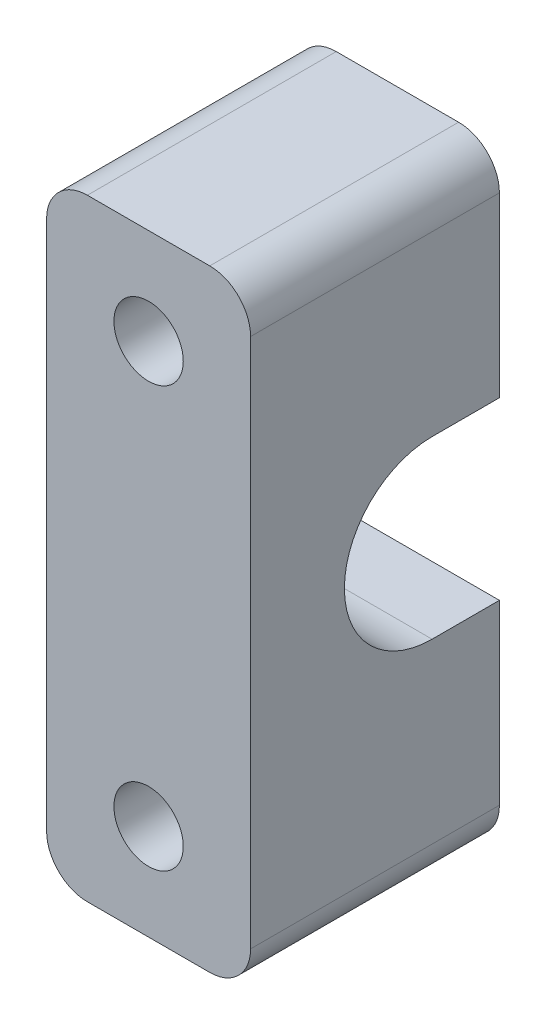
ISO-10303-21;
HEADER;
FILE_DESCRIPTION(('STEP AP214'),'2;1');
FILE_NAME('part.step','',(''),(''),'','','');
FILE_SCHEMA(('AUTOMOTIVE_DESIGN { 1 0 10303 214 1 1 1 1 }'));
ENDSEC;
DATA;
#1=APPLICATION_CONTEXT('core data for automotive mechanical design processes');
#2=APPLICATION_PROTOCOL_DEFINITION('international standard','automotive_design',2000,#1);
#3=PRODUCT_CONTEXT('',#1,'mechanical');
#4=PRODUCT('Part','Part','',(#3));
#5=PRODUCT_RELATED_PRODUCT_CATEGORY('part','',(#4));
#6=PRODUCT_DEFINITION_FORMATION('','',#4);
#7=PRODUCT_DEFINITION_CONTEXT('part definition',#1,'design');
#8=PRODUCT_DEFINITION('design','',#6,#7);
#9=PRODUCT_DEFINITION_SHAPE('','',#8);
#10=(LENGTH_UNIT() NAMED_UNIT(*) SI_UNIT(.MILLI.,.METRE.));
#11=(NAMED_UNIT(*) PLANE_ANGLE_UNIT() SI_UNIT($,.RADIAN.));
#12=(NAMED_UNIT(*) SI_UNIT($,.STERADIAN.) SOLID_ANGLE_UNIT());
#13=UNCERTAINTY_MEASURE_WITH_UNIT(LENGTH_MEASURE(1.E-05),#10,'distance_accuracy_value','');
#14=(GEOMETRIC_REPRESENTATION_CONTEXT(3) GLOBAL_UNCERTAINTY_ASSIGNED_CONTEXT((#13)) GLOBAL_UNIT_ASSIGNED_CONTEXT((#10,
#11,#12)) REPRESENTATION_CONTEXT('',''));
#15=CARTESIAN_POINT('',(0.,0.,0.));
#16=DIRECTION('',(0.,0.,1.));
#17=DIRECTION('',(1.,0.,0.));
#18=AXIS2_PLACEMENT_3D('',#15,#16,#17);
#19=CARTESIAN_POINT('',(-2.,0.,-2.8));
#20=DIRECTION('',(1.,0.,0.));
#21=DIRECTION('',(0.,0.,-1.));
#22=AXIS2_PLACEMENT_3D('',#19,#20,#21);
#23=CYLINDRICAL_SURFACE('',#22,4.3);
#24=DIRECTION('',(1.,0.,0.));
#25=VECTOR('',#24,1.);
#26=CARTESIAN_POINT('',(-16.6823022717829,4.3,-2.8));
#27=LINE('',#26,#25);
#28=CARTESIAN_POINT('',(-2.,4.3,-2.8));
#29=VERTEX_POINT('',#28);
#30=CARTESIAN_POINT('',(5.,4.3,-2.8));
#31=VERTEX_POINT('',#30);
#32=EDGE_CURVE('E149',#29,#31,#27,.T.);
#33=ORIENTED_EDGE('',*,*,#32,.T.);
#34=CARTESIAN_POINT('',(5.,0.,-2.8));
#35=DIRECTION('',(1.,0.,0.));
#36=DIRECTION('',(0.,0.,-1.));
#37=AXIS2_PLACEMENT_3D('',#34,#35,#36);
#38=CIRCLE('',#37,4.3);
#39=CARTESIAN_POINT('',(5.,-4.3,-2.8));
#40=VERTEX_POINT('',#39);
#41=EDGE_CURVE('E142',#31,#40,#38,.T.);
#42=ORIENTED_EDGE('',*,*,#41,.T.);
#43=DIRECTION('',(1.,0.,0.));
#44=VECTOR('',#43,1.);
#45=CARTESIAN_POINT('',(-16.6823022717829,-4.3,-2.8));
#46=LINE('',#45,#44);
#47=CARTESIAN_POINT('',(-2.,-4.3,-2.8));
#48=VERTEX_POINT('',#47);
#49=EDGE_CURVE('E122',#48,#40,#46,.T.);
#50=ORIENTED_EDGE('',*,*,#49,.F.);
#51=CARTESIAN_POINT('',(-2.,0.,-2.8));
#52=DIRECTION('',(1.,0.,0.));
#53=DIRECTION('',(0.,0.,-1.));
#54=AXIS2_PLACEMENT_3D('',#51,#52,#53);
#55=CIRCLE('',#54,4.3);
#56=EDGE_CURVE('E150',#29,#48,#55,.T.);
#57=ORIENTED_EDGE('',*,*,#56,.F.);
#58=EDGE_LOOP('',(#33,#42,#50,#57));
#59=FACE_BOUND('',#58,.T.);
#60=ADVANCED_FACE('F33',(#59),#23,.F.);
#61=CARTESIAN_POINT('',(5.,-15.,-6.1));
#62=DIRECTION('',(0.,0.,1.));
#63=DIRECTION('',(1.,0.,0.));
#64=AXIS2_PLACEMENT_3D('',#61,#62,#63);
#65=PLANE('',#64);
#66=CARTESIAN_POINT('',(0.,-10.3,-6.1));
#67=DIRECTION('',(0.,0.,-1.));
#68=DIRECTION('',(1.,0.,0.));
#69=AXIS2_PLACEMENT_3D('',#66,#67,#68);
#70=CIRCLE('',#69,1.7);
#71=CARTESIAN_POINT('',(1.7,-10.3,-6.1));
#72=VERTEX_POINT('',#71);
#73=EDGE_CURVE('E239',#72,#72,#70,.T.);
#74=ORIENTED_EDGE('',*,*,#73,.F.);
#75=EDGE_LOOP('',(#74));
#76=FACE_BOUND('',#75,.T.);
#77=CARTESIAN_POINT('',(0.,10.3,-6.1));
#78=DIRECTION('',(0.,0.,1.));
#79=DIRECTION('',(1.,0.,0.));
#80=AXIS2_PLACEMENT_3D('',#77,#78,#79);
#81=CIRCLE('',#80,1.7);
#82=CARTESIAN_POINT('',(1.7,10.3,-6.1));
#83=VERTEX_POINT('',#82);
#84=EDGE_CURVE('E151',#83,#83,#81,.T.);
#85=ORIENTED_EDGE('',*,*,#84,.T.);
#86=EDGE_LOOP('',(#85));
#87=FACE_BOUND('',#86,.T.);
#88=DIRECTION('',(0.,1.,0.));
#89=VECTOR('',#88,1.);
#90=CARTESIAN_POINT('',(-2.,-15.,-6.1));
#91=LINE('',#90,#89);
#92=CARTESIAN_POINT('',(-2.,-4.3,-6.1));
#93=VERTEX_POINT('',#92);
#94=CARTESIAN_POINT('',(-2.,4.3,-6.1));
#95=VERTEX_POINT('',#94);
#96=EDGE_CURVE('E181',#93,#95,#91,.T.);
#97=ORIENTED_EDGE('',*,*,#96,.F.);
#98=DIRECTION('',(1.,0.,0.));
#99=VECTOR('',#98,1.);
#100=CARTESIAN_POINT('',(-16.6823022717829,-4.3,-6.1));
#101=LINE('',#100,#99);
#102=CARTESIAN_POINT('',(5.,-4.3,-6.1));
#103=VERTEX_POINT('',#102);
#104=EDGE_CURVE('E134',#93,#103,#101,.T.);
#105=ORIENTED_EDGE('',*,*,#104,.T.);
#106=DIRECTION('',(0.,1.,0.));
#107=VECTOR('',#106,1.);
#108=CARTESIAN_POINT('',(5.,-15.,-6.1));
#109=LINE('',#108,#107);
#110=CARTESIAN_POINT('',(5.,-13.,-6.1));
#111=VERTEX_POINT('',#110);
#112=EDGE_CURVE('E145',#111,#103,#109,.T.);
#113=ORIENTED_EDGE('',*,*,#112,.F.);
#114=CARTESIAN_POINT('',(3.,-13.,-6.1));
#115=DIRECTION('',(0.,0.,1.));
#116=DIRECTION('',(1.,0.,0.));
#117=AXIS2_PLACEMENT_3D('',#114,#115,#116);
#118=CIRCLE('',#117,2.);
#119=CARTESIAN_POINT('',(3.,-15.,-6.1));
#120=VERTEX_POINT('',#119);
#121=EDGE_CURVE('E193',#111,#120,#118,.F.);
#122=ORIENTED_EDGE('',*,*,#121,.T.);
#123=DIRECTION('',(-1.,0.,0.));
#124=VECTOR('',#123,1.);
#125=CARTESIAN_POINT('',(5.,-15.,-6.1));
#126=LINE('',#125,#124);
#127=CARTESIAN_POINT('',(-3.,-15.,-6.1));
#128=VERTEX_POINT('',#127);
#129=EDGE_CURVE('E165',#120,#128,#126,.T.);
#130=ORIENTED_EDGE('',*,*,#129,.T.);
#131=CARTESIAN_POINT('',(-3.,-13.,-6.1));
#132=DIRECTION('',(0.,0.,1.));
#133=DIRECTION('',(1.,0.,0.));
#134=AXIS2_PLACEMENT_3D('',#131,#132,#133);
#135=CIRCLE('',#134,2.);
#136=CARTESIAN_POINT('',(-5.,-13.,-6.1));
#137=VERTEX_POINT('',#136);
#138=EDGE_CURVE('E195',#128,#137,#135,.F.);
#139=ORIENTED_EDGE('',*,*,#138,.T.);
#140=DIRECTION('',(0.,1.,0.));
#141=VECTOR('',#140,1.);
#142=CARTESIAN_POINT('',(-5.,-15.,-6.1));
#143=LINE('',#142,#141);
#144=CARTESIAN_POINT('',(-5.,13.,-6.1));
#145=VERTEX_POINT('',#144);
#146=EDGE_CURVE('E153',#137,#145,#143,.T.);
#147=ORIENTED_EDGE('',*,*,#146,.T.);
#148=CARTESIAN_POINT('',(-3.,13.,-6.1));
#149=DIRECTION('',(0.,0.,1.));
#150=DIRECTION('',(1.,0.,0.));
#151=AXIS2_PLACEMENT_3D('',#148,#149,#150);
#152=CIRCLE('',#151,2.);
#153=CARTESIAN_POINT('',(-3.,15.,-6.1));
#154=VERTEX_POINT('',#153);
#155=EDGE_CURVE('E191',#145,#154,#152,.F.);
#156=ORIENTED_EDGE('',*,*,#155,.T.);
#157=DIRECTION('',(-1.,0.,0.));
#158=VECTOR('',#157,1.);
#159=CARTESIAN_POINT('',(5.,15.,-6.1));
#160=LINE('',#159,#158);
#161=CARTESIAN_POINT('',(3.,15.,-6.1));
#162=VERTEX_POINT('',#161);
#163=EDGE_CURVE('E178',#162,#154,#160,.T.);
#164=ORIENTED_EDGE('',*,*,#163,.F.);
#165=CARTESIAN_POINT('',(3.,13.,-6.1));
#166=DIRECTION('',(0.,0.,1.));
#167=DIRECTION('',(1.,0.,0.));
#168=AXIS2_PLACEMENT_3D('',#165,#166,#167);
#169=CIRCLE('',#168,2.);
#170=CARTESIAN_POINT('',(5.,13.,-6.1));
#171=VERTEX_POINT('',#170);
#172=EDGE_CURVE('E188',#162,#171,#169,.F.);
#173=ORIENTED_EDGE('',*,*,#172,.T.);
#174=CARTESIAN_POINT('',(5.,4.3,-6.1));
#175=VERTEX_POINT('',#174);
#176=EDGE_CURVE('E162',#175,#171,#109,.T.);
#177=ORIENTED_EDGE('',*,*,#176,.F.);
#178=DIRECTION('',(1.,0.,0.));
#179=VECTOR('',#178,1.);
#180=CARTESIAN_POINT('',(-16.6823022717829,4.3,-6.1));
#181=LINE('',#180,#179);
#182=EDGE_CURVE('E231',#95,#175,#181,.T.);
#183=ORIENTED_EDGE('',*,*,#182,.F.);
#184=EDGE_LOOP('',(#97,#105,#113,#122,#130,#139,#147,#156,#164,#173,#177,#183));
#185=FACE_BOUND('',#184,.T.);
#186=ADVANCED_FACE('F218',(#76,#87,#185),#65,.F.);
#187=CARTESIAN_POINT('',(5.,15.,6.1));
#188=DIRECTION('',(0.,-1.,0.));
#189=DIRECTION('',(0.,0.,-1.));
#190=AXIS2_PLACEMENT_3D('',#187,#188,#189);
#191=PLANE('',#190);
#192=ORIENTED_EDGE('',*,*,#163,.T.);
#193=DIRECTION('',(0.,0.,1.));
#194=VECTOR('',#193,1.);
#195=CARTESIAN_POINT('',(-3.,15.,6.1));
#196=LINE('',#195,#194);
#197=CARTESIAN_POINT('',(-3.,15.,6.1));
#198=VERTEX_POINT('',#197);
#199=EDGE_CURVE('E11',#154,#198,#196,.T.);
#200=ORIENTED_EDGE('',*,*,#199,.T.);
#201=DIRECTION('',(-1.,0.,0.));
#202=VECTOR('',#201,1.);
#203=CARTESIAN_POINT('',(5.,15.,6.1));
#204=LINE('',#203,#202);
#205=CARTESIAN_POINT('',(3.,15.,6.1));
#206=VERTEX_POINT('',#205);
#207=EDGE_CURVE('E176',#206,#198,#204,.T.);
#208=ORIENTED_EDGE('',*,*,#207,.F.);
#209=DIRECTION('',(0.,0.,1.));
#210=VECTOR('',#209,1.);
#211=CARTESIAN_POINT('',(3.,15.,6.1));
#212=LINE('',#211,#210);
#213=EDGE_CURVE('E41',#206,#162,#212,.F.);
#214=ORIENTED_EDGE('',*,*,#213,.T.);
#215=EDGE_LOOP('',(#192,#200,#208,#214));
#216=FACE_BOUND('',#215,.T.);
#217=ADVANCED_FACE('F214',(#216),#191,.F.);
#218=CARTESIAN_POINT('',(5.,-15.,6.1));
#219=DIRECTION('',(0.,0.,-1.));
#220=DIRECTION('',(-1.,0.,0.));
#221=AXIS2_PLACEMENT_3D('',#218,#219,#220);
#222=PLANE('',#221);
#223=CARTESIAN_POINT('',(0.,-10.3,6.1));
#224=DIRECTION('',(0.,0.,-1.));
#225=DIRECTION('',(1.,0.,0.));
#226=AXIS2_PLACEMENT_3D('',#223,#224,#225);
#227=CIRCLE('',#226,1.7);
#228=CARTESIAN_POINT('',(1.7,-10.3,6.1));
#229=VERTEX_POINT('',#228);
#230=EDGE_CURVE('E237',#229,#229,#227,.T.);
#231=ORIENTED_EDGE('',*,*,#230,.T.);
#232=EDGE_LOOP('',(#231));
#233=FACE_BOUND('',#232,.T.);
#234=CARTESIAN_POINT('',(0.,10.3,6.1));
#235=DIRECTION('',(0.,0.,1.));
#236=DIRECTION('',(1.,0.,0.));
#237=AXIS2_PLACEMENT_3D('',#234,#235,#236);
#238=CIRCLE('',#237,1.7);
#239=CARTESIAN_POINT('',(1.7,10.3,6.1));
#240=VERTEX_POINT('',#239);
#241=EDGE_CURVE('E156',#240,#240,#238,.T.);
#242=ORIENTED_EDGE('',*,*,#241,.F.);
#243=EDGE_LOOP('',(#242));
#244=FACE_BOUND('',#243,.T.);
#245=DIRECTION('',(0.,-1.,0.));
#246=VECTOR('',#245,1.);
#247=CARTESIAN_POINT('',(-5.,-15.,6.1));
#248=LINE('',#247,#246);
#249=CARTESIAN_POINT('',(-5.,13.,6.1));
#250=VERTEX_POINT('',#249);
#251=CARTESIAN_POINT('',(-5.,-13.,6.1));
#252=VERTEX_POINT('',#251);
#253=EDGE_CURVE('E168',#250,#252,#248,.T.);
#254=ORIENTED_EDGE('',*,*,#253,.T.);
#255=CARTESIAN_POINT('',(-3.,-13.,6.1));
#256=DIRECTION('',(0.,0.,-1.));
#257=DIRECTION('',(-1.,0.,0.));
#258=AXIS2_PLACEMENT_3D('',#255,#256,#257);
#259=CIRCLE('',#258,2.);
#260=CARTESIAN_POINT('',(-3.,-15.,6.1));
#261=VERTEX_POINT('',#260);
#262=EDGE_CURVE('E205',#252,#261,#259,.F.);
#263=ORIENTED_EDGE('',*,*,#262,.T.);
#264=DIRECTION('',(-1.,0.,0.));
#265=VECTOR('',#264,1.);
#266=CARTESIAN_POINT('',(5.,-15.,6.1));
#267=LINE('',#266,#265);
#268=CARTESIAN_POINT('',(3.,-15.,6.1));
#269=VERTEX_POINT('',#268);
#270=EDGE_CURVE('E173',#269,#261,#267,.T.);
#271=ORIENTED_EDGE('',*,*,#270,.F.);
#272=CARTESIAN_POINT('',(3.,-13.,6.1));
#273=DIRECTION('',(0.,0.,-1.));
#274=DIRECTION('',(-1.,0.,0.));
#275=AXIS2_PLACEMENT_3D('',#272,#273,#274);
#276=CIRCLE('',#275,2.);
#277=CARTESIAN_POINT('',(5.,-13.,6.1));
#278=VERTEX_POINT('',#277);
#279=EDGE_CURVE('E203',#269,#278,#276,.F.);
#280=ORIENTED_EDGE('',*,*,#279,.T.);
#281=DIRECTION('',(0.,-1.,0.));
#282=VECTOR('',#281,1.);
#283=CARTESIAN_POINT('',(5.,-15.,6.1));
#284=LINE('',#283,#282);
#285=CARTESIAN_POINT('',(5.,13.,6.1));
#286=VERTEX_POINT('',#285);
#287=EDGE_CURVE('E161',#286,#278,#284,.T.);
#288=ORIENTED_EDGE('',*,*,#287,.F.);
#289=CARTESIAN_POINT('',(3.,13.,6.1));
#290=DIRECTION('',(0.,0.,-1.));
#291=DIRECTION('',(-1.,0.,0.));
#292=AXIS2_PLACEMENT_3D('',#289,#290,#291);
#293=CIRCLE('',#292,2.);
#294=EDGE_CURVE('E55',#286,#206,#293,.F.);
#295=ORIENTED_EDGE('',*,*,#294,.T.);
#296=ORIENTED_EDGE('',*,*,#207,.T.);
#297=CARTESIAN_POINT('',(-3.,13.,6.1));
#298=DIRECTION('',(0.,0.,-1.));
#299=DIRECTION('',(-1.,0.,0.));
#300=AXIS2_PLACEMENT_3D('',#297,#298,#299);
#301=CIRCLE('',#300,2.);
#302=EDGE_CURVE('E48',#198,#250,#301,.F.);
#303=ORIENTED_EDGE('',*,*,#302,.T.);
#304=EDGE_LOOP('',(#254,#263,#271,#280,#288,#295,#296,#303));
#305=FACE_BOUND('',#304,.T.);
#306=ADVANCED_FACE('F223',(#233,#244,#305),#222,.F.);
#307=CARTESIAN_POINT('',(5.,-15.,6.1));
#308=DIRECTION('',(0.,1.,0.));
#309=DIRECTION('',(0.,0.,1.));
#310=AXIS2_PLACEMENT_3D('',#307,#308,#309);
#311=PLANE('',#310);
#312=ORIENTED_EDGE('',*,*,#270,.T.);
#313=DIRECTION('',(0.,0.,-1.));
#314=VECTOR('',#313,1.);
#315=CARTESIAN_POINT('',(-3.,-15.,-6.1));
#316=LINE('',#315,#314);
#317=EDGE_CURVE('E185',#261,#128,#316,.T.);
#318=ORIENTED_EDGE('',*,*,#317,.T.);
#319=ORIENTED_EDGE('',*,*,#129,.F.);
#320=DIRECTION('',(0.,0.,-1.));
#321=VECTOR('',#320,1.);
#322=CARTESIAN_POINT('',(3.,-15.,6.1));
#323=LINE('',#322,#321);
#324=EDGE_CURVE('E183',#120,#269,#323,.F.);
#325=ORIENTED_EDGE('',*,*,#324,.T.);
#326=EDGE_LOOP('',(#312,#318,#319,#325));
#327=FACE_BOUND('',#326,.T.);
#328=ADVANCED_FACE('F249',(#327),#311,.F.);
#329=CARTESIAN_POINT('',(5.,0.,0.));
#330=DIRECTION('',(-1.,0.,0.));
#331=DIRECTION('',(0.,0.,1.));
#332=AXIS2_PLACEMENT_3D('',#329,#330,#331);
#333=PLANE('',#332);
#334=ORIENTED_EDGE('',*,*,#41,.F.);
#335=DIRECTION('',(0.,0.,1.));
#336=VECTOR('',#335,1.);
#337=CARTESIAN_POINT('',(5.,4.3,-2.8));
#338=LINE('',#337,#336);
#339=EDGE_CURVE('E135',#175,#31,#338,.T.);
#340=ORIENTED_EDGE('',*,*,#339,.F.);
#341=ORIENTED_EDGE('',*,*,#176,.T.);
#342=DIRECTION('',(0.,0.,1.));
#343=VECTOR('',#342,1.);
#344=CARTESIAN_POINT('',(5.,13.,0.));
#345=LINE('',#344,#343);
#346=EDGE_CURVE('E207',#171,#286,#345,.T.);
#347=ORIENTED_EDGE('',*,*,#346,.T.);
#348=ORIENTED_EDGE('',*,*,#287,.T.);
#349=DIRECTION('',(0.,0.,-1.));
#350=VECTOR('',#349,1.);
#351=CARTESIAN_POINT('',(5.,-13.,0.));
#352=LINE('',#351,#350);
#353=EDGE_CURVE('E210',#278,#111,#352,.T.);
#354=ORIENTED_EDGE('',*,*,#353,.T.);
#355=ORIENTED_EDGE('',*,*,#112,.T.);
#356=DIRECTION('',(0.,0.,-1.));
#357=VECTOR('',#356,1.);
#358=CARTESIAN_POINT('',(5.,-4.3,-2.8));
#359=LINE('',#358,#357);
#360=EDGE_CURVE('E126',#40,#103,#359,.T.);
#361=ORIENTED_EDGE('',*,*,#360,.F.);
#362=EDGE_LOOP('',(#334,#340,#341,#347,#348,#354,#355,#361));
#363=FACE_BOUND('',#362,.T.);
#364=ADVANCED_FACE('F140',(#363),#333,.F.);
#365=CARTESIAN_POINT('',(-5.,0.,0.));
#366=DIRECTION('',(-1.,0.,0.));
#367=DIRECTION('',(0.,0.,1.));
#368=AXIS2_PLACEMENT_3D('',#365,#366,#367);
#369=PLANE('',#368);
#370=ORIENTED_EDGE('',*,*,#146,.F.);
#371=DIRECTION('',(0.,0.,-1.));
#372=VECTOR('',#371,1.);
#373=CARTESIAN_POINT('',(-5.,-13.,6.1));
#374=LINE('',#373,#372);
#375=EDGE_CURVE('E199',#137,#252,#374,.F.);
#376=ORIENTED_EDGE('',*,*,#375,.T.);
#377=ORIENTED_EDGE('',*,*,#253,.F.);
#378=DIRECTION('',(0.,0.,1.));
#379=VECTOR('',#378,1.);
#380=CARTESIAN_POINT('',(-5.,13.,-6.1));
#381=LINE('',#380,#379);
#382=EDGE_CURVE('E197',#250,#145,#381,.F.);
#383=ORIENTED_EDGE('',*,*,#382,.T.);
#384=EDGE_LOOP('',(#370,#376,#377,#383));
#385=FACE_BOUND('',#384,.T.);
#386=ADVANCED_FACE('F272',(#385),#369,.T.);
#387=CARTESIAN_POINT('',(-2.,0.,-2.8));
#388=DIRECTION('',(1.,0.,0.));
#389=DIRECTION('',(0.,0.,-1.));
#390=AXIS2_PLACEMENT_3D('',#387,#388,#389);
#391=PLANE('',#390);
#392=DIRECTION('',(0.,0.,-1.));
#393=VECTOR('',#392,1.);
#394=CARTESIAN_POINT('',(-2.,4.3,-2.8));
#395=LINE('',#394,#393);
#396=EDGE_CURVE('E238',#29,#95,#395,.T.);
#397=ORIENTED_EDGE('',*,*,#396,.F.);
#398=ORIENTED_EDGE('',*,*,#56,.T.);
#399=DIRECTION('',(0.,0.,1.));
#400=VECTOR('',#399,1.);
#401=CARTESIAN_POINT('',(-2.,-4.3,-2.8));
#402=LINE('',#401,#400);
#403=EDGE_CURVE('E129',#93,#48,#402,.T.);
#404=ORIENTED_EDGE('',*,*,#403,.F.);
#405=ORIENTED_EDGE('',*,*,#96,.T.);
#406=EDGE_LOOP('',(#397,#398,#404,#405));
#407=FACE_BOUND('',#406,.T.);
#408=ADVANCED_FACE('F268',(#407),#391,.T.);
#409=CARTESIAN_POINT('',(0.,10.3,-6.1));
#410=DIRECTION('',(0.,0.,1.));
#411=DIRECTION('',(1.,0.,0.));
#412=AXIS2_PLACEMENT_3D('',#409,#410,#411);
#413=CYLINDRICAL_SURFACE('',#412,1.7);
#414=ORIENTED_EDGE('',*,*,#84,.F.);
#415=EDGE_LOOP('',(#414));
#416=FACE_BOUND('',#415,.T.);
#417=ORIENTED_EDGE('',*,*,#241,.T.);
#418=EDGE_LOOP('',(#417));
#419=FACE_BOUND('',#418,.T.);
#420=ADVANCED_FACE('F246',(#416,#419),#413,.F.);
#421=CARTESIAN_POINT('',(0.,-10.3,-6.1));
#422=DIRECTION('',(0.,0.,1.));
#423=DIRECTION('',(1.,0.,0.));
#424=AXIS2_PLACEMENT_3D('',#421,#422,#423);
#425=CYLINDRICAL_SURFACE('',#424,1.7);
#426=ORIENTED_EDGE('',*,*,#73,.T.);
#427=EDGE_LOOP('',(#426));
#428=FACE_BOUND('',#427,.T.);
#429=ORIENTED_EDGE('',*,*,#230,.F.);
#430=EDGE_LOOP('',(#429));
#431=FACE_BOUND('',#430,.T.);
#432=ADVANCED_FACE('F296',(#428,#431),#425,.F.);
#433=CARTESIAN_POINT('',(-3.,-13.,6.1));
#434=DIRECTION('',(0.,0.,1.));
#435=DIRECTION('',(1.,0.,0.));
#436=AXIS2_PLACEMENT_3D('',#433,#434,#435);
#437=CYLINDRICAL_SURFACE('',#436,2.);
#438=ORIENTED_EDGE('',*,*,#262,.F.);
#439=ORIENTED_EDGE('',*,*,#375,.F.);
#440=ORIENTED_EDGE('',*,*,#138,.F.);
#441=ORIENTED_EDGE('',*,*,#317,.F.);
#442=EDGE_LOOP('',(#438,#439,#440,#441));
#443=FACE_BOUND('',#442,.T.);
#444=ADVANCED_FACE('F284',(#443),#437,.T.);
#445=CARTESIAN_POINT('',(3.,-13.,0.));
#446=DIRECTION('',(0.,0.,-1.));
#447=DIRECTION('',(-1.,0.,0.));
#448=AXIS2_PLACEMENT_3D('',#445,#446,#447);
#449=CYLINDRICAL_SURFACE('',#448,2.);
#450=ORIENTED_EDGE('',*,*,#279,.F.);
#451=ORIENTED_EDGE('',*,*,#324,.F.);
#452=ORIENTED_EDGE('',*,*,#121,.F.);
#453=ORIENTED_EDGE('',*,*,#353,.F.);
#454=EDGE_LOOP('',(#450,#451,#452,#453));
#455=FACE_BOUND('',#454,.T.);
#456=ADVANCED_FACE('F228',(#455),#449,.T.);
#457=CARTESIAN_POINT('',(-3.,13.,6.1));
#458=DIRECTION('',(0.,0.,-1.));
#459=DIRECTION('',(-1.,0.,0.));
#460=AXIS2_PLACEMENT_3D('',#457,#458,#459);
#461=CYLINDRICAL_SURFACE('',#460,2.);
#462=ORIENTED_EDGE('',*,*,#155,.F.);
#463=ORIENTED_EDGE('',*,*,#382,.F.);
#464=ORIENTED_EDGE('',*,*,#302,.F.);
#465=ORIENTED_EDGE('',*,*,#199,.F.);
#466=EDGE_LOOP('',(#462,#463,#464,#465));
#467=FACE_BOUND('',#466,.T.);
#468=ADVANCED_FACE('F286',(#467),#461,.T.);
#469=CARTESIAN_POINT('',(3.,13.,0.));
#470=DIRECTION('',(0.,0.,1.));
#471=DIRECTION('',(1.,0.,0.));
#472=AXIS2_PLACEMENT_3D('',#469,#470,#471);
#473=CYLINDRICAL_SURFACE('',#472,2.);
#474=ORIENTED_EDGE('',*,*,#172,.F.);
#475=ORIENTED_EDGE('',*,*,#213,.F.);
#476=ORIENTED_EDGE('',*,*,#294,.F.);
#477=ORIENTED_EDGE('',*,*,#346,.F.);
#478=EDGE_LOOP('',(#474,#475,#476,#477));
#479=FACE_BOUND('',#478,.T.);
#480=ADVANCED_FACE('F35',(#479),#473,.T.);
#481=CARTESIAN_POINT('',(-16.6823022717829,4.3,-2.8));
#482=DIRECTION('',(0.,1.,0.));
#483=DIRECTION('',(0.,0.,1.));
#484=AXIS2_PLACEMENT_3D('',#481,#482,#483);
#485=PLANE('',#484);
#486=ORIENTED_EDGE('',*,*,#396,.T.);
#487=ORIENTED_EDGE('',*,*,#182,.T.);
#488=ORIENTED_EDGE('',*,*,#339,.T.);
#489=ORIENTED_EDGE('',*,*,#32,.F.);
#490=EDGE_LOOP('',(#486,#487,#488,#489));
#491=FACE_BOUND('',#490,.T.);
#492=ADVANCED_FACE('F292',(#491),#485,.F.);
#493=CARTESIAN_POINT('',(-16.6823022717829,-4.3,-2.8));
#494=DIRECTION('',(0.,-1.,0.));
#495=DIRECTION('',(0.,0.,-1.));
#496=AXIS2_PLACEMENT_3D('',#493,#494,#495);
#497=PLANE('',#496);
#498=ORIENTED_EDGE('',*,*,#403,.T.);
#499=ORIENTED_EDGE('',*,*,#49,.T.);
#500=ORIENTED_EDGE('',*,*,#360,.T.);
#501=ORIENTED_EDGE('',*,*,#104,.F.);
#502=EDGE_LOOP('',(#498,#499,#500,#501));
#503=FACE_BOUND('',#502,.T.);
#504=ADVANCED_FACE('F124',(#503),#497,.F.);
#505=CLOSED_SHELL('',(#60,#186,#217,#306,#328,#364,#386,#408,#420,#432,#444,#456,#468,#480,#492,#504));
#506=MANIFOLD_SOLID_BREP('B2',#505);
#507=ADVANCED_BREP_SHAPE_REPRESENTATION('',(#18,#506),#14);
#508=SHAPE_DEFINITION_REPRESENTATION(#9,#507);
ENDSEC;
END-ISO-10303-21;
